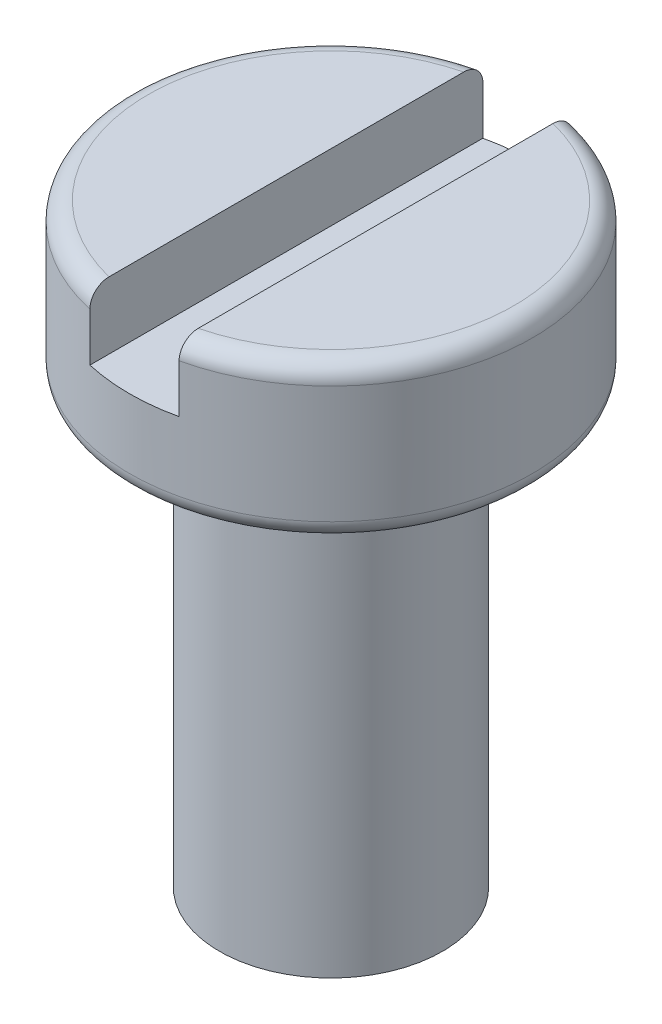
ISO-10303-21;
HEADER;
FILE_DESCRIPTION(('STEP AP214'),'2;1');
FILE_NAME('part.step','',(''),(''),'','','');
FILE_SCHEMA(('AUTOMOTIVE_DESIGN { 1 0 10303 214 1 1 1 1 }'));
ENDSEC;
DATA;
#1=APPLICATION_CONTEXT('core data for automotive mechanical design processes');
#2=APPLICATION_PROTOCOL_DEFINITION('international standard','automotive_design',2000,#1);
#3=PRODUCT_CONTEXT('',#1,'mechanical');
#4=PRODUCT('Part','Part','',(#3));
#5=PRODUCT_RELATED_PRODUCT_CATEGORY('part','',(#4));
#6=PRODUCT_DEFINITION_FORMATION('','',#4);
#7=PRODUCT_DEFINITION_CONTEXT('part definition',#1,'design');
#8=PRODUCT_DEFINITION('design','',#6,#7);
#9=PRODUCT_DEFINITION_SHAPE('','',#8);
#10=(LENGTH_UNIT() NAMED_UNIT(*) SI_UNIT(.MILLI.,.METRE.));
#11=(NAMED_UNIT(*) PLANE_ANGLE_UNIT() SI_UNIT($,.RADIAN.));
#12=(NAMED_UNIT(*) SI_UNIT($,.STERADIAN.) SOLID_ANGLE_UNIT());
#13=UNCERTAINTY_MEASURE_WITH_UNIT(LENGTH_MEASURE(1.E-05),#10,'distance_accuracy_value','');
#14=(GEOMETRIC_REPRESENTATION_CONTEXT(3) GLOBAL_UNCERTAINTY_ASSIGNED_CONTEXT((#13)) GLOBAL_UNIT_ASSIGNED_CONTEXT((#10,
#11,#12)) REPRESENTATION_CONTEXT('',''));
#15=CARTESIAN_POINT('',(0.,0.,0.));
#16=DIRECTION('',(0.,0.,1.));
#17=DIRECTION('',(1.,0.,0.));
#18=AXIS2_PLACEMENT_3D('',#15,#16,#17);
#19=CARTESIAN_POINT('',(0.,20.,0.));
#20=DIRECTION('',(0.,-1.,0.));
#21=DIRECTION('',(0.,0.,-1.));
#22=AXIS2_PLACEMENT_3D('',#19,#20,#21);
#23=PLANE('',#22);
#24=CARTESIAN_POINT('',(0.,20.,0.));
#25=DIRECTION('',(0.,-1.,0.));
#26=DIRECTION('',(0.,0.,-1.));
#27=AXIS2_PLACEMENT_3D('',#24,#25,#26);
#28=CIRCLE('',#27,2.46);
#29=CARTESIAN_POINT('',(-0.6,20.,-2.38570744224846));
#30=VERTEX_POINT('',#29);
#31=CARTESIAN_POINT('',(-0.6,20.,2.3857074422486));
#32=VERTEX_POINT('',#31);
#33=EDGE_CURVE('E104',#30,#32,#28,.F.);
#34=ORIENTED_EDGE('',*,*,#33,.T.);
#35=DIRECTION('',(0.,0.,1.));
#36=VECTOR('',#35,1.);
#37=CARTESIAN_POINT('',(-0.6,20.,2.71102334228302));
#38=LINE('',#37,#36);
#39=EDGE_CURVE('E101',#30,#32,#38,.T.);
#40=ORIENTED_EDGE('',*,*,#39,.F.);
#41=EDGE_LOOP('',(#34,#40));
#42=FACE_BOUND('',#41,.T.);
#43=ADVANCED_FACE('F35',(#42),#23,.F.);
#44=CARTESIAN_POINT('',(0.,19.75,0.));
#45=DIRECTION('',(0.,-1.,0.));
#46=DIRECTION('',(0.,0.,-1.));
#47=AXIS2_PLACEMENT_3D('',#44,#45,#46);
#48=TOROIDAL_SURFACE('',#47,2.46,0.25);
#49=CARTESIAN_POINT('',(-0.6,19.9057779269637,2.58686231688076));
#50=CARTESIAN_POINT('',(-0.6,19.8950398183509,2.5956435679496));
#51=CARTESIAN_POINT('',(-0.6,19.8835649113459,2.60353742344512));
#52=CARTESIAN_POINT('',(-0.6,19.8594480937063,2.61730071427246));
#53=CARTESIAN_POINT('',(-0.6,19.846805116745,2.62316827619331));
#54=CARTESIAN_POINT('',(-0.6,19.8207049337922,2.63268735414627));
#55=CARTESIAN_POINT('',(-0.6,19.8072475164309,2.63633829216775));
#56=CARTESIAN_POINT('',(-0.6,19.7799107452415,2.64130101178219));
#57=CARTESIAN_POINT('',(-0.6,19.7660314865879,2.64261331708466));
#58=CARTESIAN_POINT('',(-0.6,19.738395178757,2.64285617965291));
#59=CARTESIAN_POINT('',(-0.6,19.7246383380415,2.64181105425246));
#60=CARTESIAN_POINT('',(-0.6,19.6974964874994,2.6374228928476));
#61=CARTESIAN_POINT('',(-0.6,19.6841114783171,2.63407985286123));
#62=CARTESIAN_POINT('',(-0.6,19.6581028909833,2.62520726129129));
#63=CARTESIAN_POINT('',(-0.6,19.645478566111,2.61967989560636));
#64=CARTESIAN_POINT('',(-0.6,19.6213204884943,2.60661096468353));
#65=CARTESIAN_POINT('',(-0.6,19.609786785512,2.59906930759908));
#66=CARTESIAN_POINT('',(-0.6,19.5879670918565,2.58208635128699));
#67=CARTESIAN_POINT('',(-0.6,19.5776997639723,2.57262109024571));
#68=CARTESIAN_POINT('',(-0.6,19.5588555560857,2.55213651548936));
#69=CARTESIAN_POINT('',(-0.6,19.5502788528209,2.54111703950326));
#70=CARTESIAN_POINT('',(-0.6,19.5348419859735,2.51756279317136));
#71=CARTESIAN_POINT('',(-0.6,19.5280268479349,2.50499852227153));
#72=CARTESIAN_POINT('',(-0.6,19.5165412180445,2.47892562165189));
#73=CARTESIAN_POINT('',(-0.6,19.5118710171225,2.46541686411225));
#74=CARTESIAN_POINT('',(-0.6,19.5046834040679,2.43746147305775));
#75=CARTESIAN_POINT('',(-0.6,19.5022253760787,2.42299956182772));
#76=CARTESIAN_POINT('',(-0.6,19.4997225636304,2.39386809017465));
#77=CARTESIAN_POINT('',(-0.6,19.4996780748111,2.37919850453324));
#78=CARTESIAN_POINT('',(-0.6,19.5020180153436,2.3497740984476));
#79=CARTESIAN_POINT('',(-0.6,19.5044483852974,2.3350229106946));
#80=CARTESIAN_POINT('',(-0.6,19.5117449070815,2.30613455183196));
#81=CARTESIAN_POINT('',(-0.6,19.5166111916129,2.29199741421948));
#82=CARTESIAN_POINT('',(-0.6,19.5286718984968,2.26471817845948));
#83=CARTESIAN_POINT('',(-0.6,19.5358709457048,2.25157812149445));
#84=CARTESIAN_POINT('',(-0.6,19.5524143077675,2.22672417348261));
#85=CARTESIAN_POINT('',(-0.6,19.5617584549328,2.21501017106599));
#86=CARTESIAN_POINT('',(-0.6,19.5821446976601,2.19359931327809));
#87=CARTESIAN_POINT('',(-0.6,19.5931500850528,2.18386754370457));
#88=CARTESIAN_POINT('',(-0.6,19.6166881125292,2.16646889601282));
#89=CARTESIAN_POINT('',(-0.6,19.6292204309981,2.15880158414973));
#90=CARTESIAN_POINT('',(-0.6,19.654994143128,2.14603352411427));
#91=CARTESIAN_POINT('',(-0.6,19.6681962508577,2.14085347697661));
#92=CARTESIAN_POINT('',(-0.6,19.6952992227209,2.13286505733002));
#93=CARTESIAN_POINT('',(-0.6,19.7091999374493,2.13005617998664));
#94=CARTESIAN_POINT('',(-0.6,19.7368363949329,2.12696449025801));
#95=CARTESIAN_POINT('',(-0.6,19.7505636233152,2.12660516557791));
#96=CARTESIAN_POINT('',(-0.6,19.7778789014398,2.12822242302424));
#97=CARTESIAN_POINT('',(-0.6,19.7914669628874,2.13019880703996));
#98=CARTESIAN_POINT('',(-0.6,19.8179788523567,2.13638478002833));
#99=CARTESIAN_POINT('',(-0.6,19.8309079857046,2.14057171283409));
#100=CARTESIAN_POINT('',(-0.6,19.8558965522215,2.15102236109181));
#101=CARTESIAN_POINT('',(-0.6,19.8679559346654,2.15728619755261));
#102=CARTESIAN_POINT('',(-0.6,19.8910843669919,2.17180899084781));
#103=CARTESIAN_POINT('',(-0.6,19.9021337939875,2.18009916085056));
#104=CARTESIAN_POINT('',(-0.6,19.9227404635454,2.19836203634967));
#105=CARTESIAN_POINT('',(-0.6,19.9322974761134,2.20833500068789));
#106=CARTESIAN_POINT('',(-0.6,19.9499851160373,2.23003056226405));
#107=CARTESIAN_POINT('',(-0.6,19.958058183776,2.24180007994945));
#108=CARTESIAN_POINT('',(-0.6,19.972186772722,2.26649331028083));
#109=CARTESIAN_POINT('',(-0.6,19.9782419447608,2.27941722218843));
#110=CARTESIAN_POINT('',(-0.6,19.9883586493524,2.30650202512867));
#111=CARTESIAN_POINT('',(-0.6,19.9923493322226,2.32068941039095));
#112=CARTESIAN_POINT('',(-0.6,19.9979369938959,2.34952799110328));
#113=CARTESIAN_POINT('',(-0.6,19.9995337847543,2.36417922287773));
#114=CARTESIAN_POINT('',(-0.6,20.000296327843,2.39379345631476));
#115=CARTESIAN_POINT('',(-0.6,19.9994206262247,2.40875754873725));
#116=CARTESIAN_POINT('',(-0.6,19.9951594147004,2.43832912201416));
#117=CARTESIAN_POINT('',(-0.6,19.9917732700265,2.45293651171087));
#118=CARTESIAN_POINT('',(-0.6,19.9825823199898,2.48131275745753));
#119=CARTESIAN_POINT('',(-0.6,19.9767860479825,2.49508437744055));
#120=CARTESIAN_POINT('',(-0.6,19.9629195439454,2.5214172843565));
#121=CARTESIAN_POINT('',(-0.6,19.9548522718015,2.53398011833989));
#122=CARTESIAN_POINT('',(-0.6,19.9399012555252,2.55332109446276));
#123=CARTESIAN_POINT('',(-0.6,19.9336151471017,2.56056880475899));
#124=CARTESIAN_POINT('',(-0.6,19.9202625315426,2.57430626948078));
#125=CARTESIAN_POINT('',(-0.6,19.9131960419394,2.58079604092775));
#126=CARTESIAN_POINT('',(-0.6,19.9057779269637,2.58686231688076));
#127=B_SPLINE_CURVE_WITH_KNOTS('',3,(#49,#50,#51,#52,#53,#54,#55,#56,#57,#58,#59,#60,#61,#62,
#63,#64,#65,#66,#67,#68,#69,#70,#71,#72,#73,#74,#75,#76,#77,#78,#79,#80,#81,#82,#83,#84,#85,#86,
#87,#88,#89,#90,#91,#92,#93,#94,#95,#96,#97,#98,#99,#100,#101,#102,#103,#104,#105,#106,#107,
#108,#109,#110,#111,#112,#113,#114,#115,#116,#117,#118,#119,#120,#121,#122,#123,#124,#125,#126),
.UNSPECIFIED.,.T.,.F.,(4,2,2,2,2,2,2,2,2,2,2,2,2,2,2,2,2,2,2,2,2,2,2,2,2,2,2,2,2,2,2,2,2,2,2,2,
2,2,4),(0.,0.0415802938971037,0.083198928600957,0.124828411195371,0.166448570180792,
0.207641375076417,0.248834251353299,0.289986009055909,0.331139643494163,0.372841362924238,
0.414547439535753,0.457232632476987,0.499923613339573,0.543729095436656,0.587539943353091,
0.632179143563909,0.676820775845968,0.721551460228282,0.766278649058879,0.810132680496136,
0.853977490950431,0.896312268610293,0.938638030699984,0.979635425017785,1.02062934225808,
1.06121103910052,1.10179510081268,1.14304877711473,1.18430880471495,1.22693204392473,
1.26956265466308,1.3135726975485,1.35758619548361,1.40234198477537,1.44710909447208,
1.49171903241248,1.53627109549314,1.56499629658943,1.59372085246534),.UNSPECIFIED.);
#128=CARTESIAN_POINT('',(-0.6,19.75,2.64274478525649));
#129=VERTEX_POINT('',#128);
#130=EDGE_CURVE('E58',#32,#129,#127,.T.);
#131=ORIENTED_EDGE('',*,*,#130,.F.);
#132=ORIENTED_EDGE('',*,*,#33,.F.);
#133=CARTESIAN_POINT('',(-0.6,19.8944024686671,-2.17466848008618));
#134=CARTESIAN_POINT('',(-0.6,19.883309846262,-2.16652688736432));
#135=CARTESIAN_POINT('',(-0.6,19.8715393901536,-2.15929544056344));
#136=CARTESIAN_POINT('',(-0.6,19.8469488212528,-2.14689265741792));
#137=CARTESIAN_POINT('',(-0.6,19.8341278870049,-2.14172295221508));
#138=CARTESIAN_POINT('',(-0.6,19.8077853460394,-2.13362409480365));
#139=CARTESIAN_POINT('',(-0.6,19.794263294155,-2.13069638519483));
#140=CARTESIAN_POINT('',(-0.6,19.7669202433074,-2.12719403278441));
#141=CARTESIAN_POINT('',(-0.6,19.7530993134886,-2.12661885146695));
#142=CARTESIAN_POINT('',(-0.6,19.7257732920088,-2.12783146110016));
#143=CARTESIAN_POINT('',(-0.6,19.712266594452,-2.12958343059428));
#144=CARTESIAN_POINT('',(-0.6,19.6857384749176,-2.13532569735921));
#145=CARTESIAN_POINT('',(-0.6,19.6727170604,-2.13931602902404));
#146=CARTESIAN_POINT('',(-0.6,19.6474863404887,-2.1494105923049));
#147=CARTESIAN_POINT('',(-0.6,19.635279076258,-2.15551991523306));
#148=CARTESIAN_POINT('',(-0.6,19.6120284455293,-2.16965153318031));
#149=CARTESIAN_POINT('',(-0.6,19.6009852039983,-2.17767403329327));
#150=CARTESIAN_POINT('',(-0.6,19.5800642470021,-2.19561844754873));
#151=CARTESIAN_POINT('',(-0.6,19.5702241638525,-2.20558420676426));
#152=CARTESIAN_POINT('',(-0.6,19.5522879155651,-2.22697713536075));
#153=CARTESIAN_POINT('',(-0.6,19.5441920464871,-2.23840455231715));
#154=CARTESIAN_POINT('',(-0.6,19.5296784229926,-2.26282410847462));
#155=CARTESIAN_POINT('',(-0.6,19.5233291210497,-2.27585694646556));
#156=CARTESIAN_POINT('',(-0.6,19.5128429916506,-2.30278438881787));
#157=CARTESIAN_POINT('',(-0.6,19.5087065078549,-2.31667912666237));
#158=CARTESIAN_POINT('',(-0.6,19.5026635081991,-2.34533487622194));
#159=CARTESIAN_POINT('',(-0.6,19.500819560799,-2.36010911604456));
#160=CARTESIAN_POINT('',(-0.6,19.4996171492246,-2.38975919377417));
#161=CARTESIAN_POINT('',(-0.6,19.500258861375,-2.40463503881397));
#162=CARTESIAN_POINT('',(-0.6,19.5040358851863,-2.43418181941932));
#163=CARTESIAN_POINT('',(-0.6,19.5071898869517,-2.44885037722511));
#164=CARTESIAN_POINT('',(-0.6,19.5159467663178,-2.47743847402221));
#165=CARTESIAN_POINT('',(-0.6,19.5215495385545,-2.49135804521147));
#166=CARTESIAN_POINT('',(-0.6,19.5349828775226,-2.51785900108877));
#167=CARTESIAN_POINT('',(-0.6,19.5427846303755,-2.53045497621151));
#168=CARTESIAN_POINT('',(-0.6,19.5604427436654,-2.55411450413128));
#169=CARTESIAN_POINT('',(-0.6,19.5702988333929,-2.56517825851681));
#170=CARTESIAN_POINT('',(-0.6,19.5915255957485,-2.58516246124834));
#171=CARTESIAN_POINT('',(-0.6,19.6028525595357,-2.59412932678523));
#172=CARTESIAN_POINT('',(-0.6,19.6268844133151,-2.60997367876158));
#173=CARTESIAN_POINT('',(-0.6,19.639589089596,-2.61685148862899));
#174=CARTESIAN_POINT('',(-0.6,19.665659389012,-2.6281382460571));
#175=CARTESIAN_POINT('',(-0.6,19.6789992721377,-2.6326066819527));
#176=CARTESIAN_POINT('',(-0.6,19.7062466045649,-2.6391957173654));
#177=CARTESIAN_POINT('',(-0.6,19.7201539880588,-2.64131658831051));
#178=CARTESIAN_POINT('',(-0.6,19.7478812567646,-2.64312421655654));
#179=CARTESIAN_POINT('',(-0.6,19.7616984300182,-2.64285282687362));
#180=CARTESIAN_POINT('',(-0.6,19.7890887423948,-2.63998487487521));
#181=CARTESIAN_POINT('',(-0.6,19.8026618917013,-2.63738840981912));
#182=CARTESIAN_POINT('',(-0.6,19.8291322877508,-2.62996726244901));
#183=CARTESIAN_POINT('',(-0.6,19.8420317379529,-2.62515042644825));
#184=CARTESIAN_POINT('',(-0.6,19.8668513236063,-2.61344256334287));
#185=CARTESIAN_POINT('',(-0.6,19.8787714252024,-2.60655146457123));
#186=CARTESIAN_POINT('',(-0.6,19.901442031466,-2.59081746857535));
#187=CARTESIAN_POINT('',(-0.6,19.9121780352306,-2.58195369313075));
#188=CARTESIAN_POINT('',(-0.6,19.9320495300079,-2.56258513390767));
#189=CARTESIAN_POINT('',(-0.6,19.9411848615979,-2.55208018686957));
#190=CARTESIAN_POINT('',(-0.6,19.9578158880632,-2.52948107517064));
#191=CARTESIAN_POINT('',(-0.6,19.9652706100935,-2.51735676836809));
#192=CARTESIAN_POINT('',(-0.6,19.9780989930115,-2.49205357024425));
#193=CARTESIAN_POINT('',(-0.6,19.983472374073,-2.47887453740736));
#194=CARTESIAN_POINT('',(-0.6,19.9921323415263,-2.45146527387591));
#195=CARTESIAN_POINT('',(-0.6,19.9953602692204,-2.43721650353487));
#196=CARTESIAN_POINT('',(-0.6,19.9994319700037,-2.40838263421632));
#197=CARTESIAN_POINT('',(-0.6,20.0002755259457,-2.39379750472817));
#198=CARTESIAN_POINT('',(-0.6,19.999559832905,-2.36438314286838));
#199=CARTESIAN_POINT('',(-0.6,19.9979504524109,-2.34955511187288));
#200=CARTESIAN_POINT('',(-0.6,19.9922792732344,-2.3203705929169));
#201=CARTESIAN_POINT('',(-0.6,19.9882167164322,-2.3060142521724));
#202=CARTESIAN_POINT('',(-0.6,19.9777097480094,-2.27810596316031));
#203=CARTESIAN_POINT('',(-0.6,19.9712516736316,-2.2645591569393));
#204=CARTESIAN_POINT('',(-0.6,19.9561211900623,-2.23877753931798));
#205=CARTESIAN_POINT('',(-0.6,19.9474515009904,-2.22654114227506));
#206=CARTESIAN_POINT('',(-0.6,19.9313801864166,-2.20759176204346));
#207=CARTESIAN_POINT('',(-0.6,19.9245303985509,-2.20040383931934));
#208=CARTESIAN_POINT('',(-0.6,19.9100385586368,-2.1868758926182));
#209=CARTESIAN_POINT('',(-0.6,19.9023965328193,-2.18053584058426));
#210=CARTESIAN_POINT('',(-0.6,19.8944024686671,-2.17466848008618));
#211=B_SPLINE_CURVE_WITH_KNOTS('',3,(#133,#134,#135,#136,#137,#138,#139,#140,#141,#142,#143,
#144,#145,#146,#147,#148,#149,#150,#151,#152,#153,#154,#155,#156,#157,#158,#159,#160,#161,#162,
#163,#164,#165,#166,#167,#168,#169,#170,#171,#172,#173,#174,#175,#176,#177,#178,#179,#180,#181,
#182,#183,#184,#185,#186,#187,#188,#189,#190,#191,#192,#193,#194,#195,#196,#197,#198,#199,#200,
#201,#202,#203,#204,#205,#206,#207,#208,#209,#210),.UNSPECIFIED.,.T.,.F.,(4,2,2,2,2,2,2,2,2,2,2,
2,2,2,2,2,2,2,2,2,2,2,2,2,2,2,2,2,2,2,2,2,2,2,2,2,2,2,4),(0.,0.041244633660872,
0.0825218334872765,0.123825570637018,0.165119852443379,0.205785806789995,0.246452386014894,
0.287217359785701,0.327986705554893,0.369812851829636,0.411646092017453,0.454939786369004,
0.498240202472458,0.542698143433272,0.587159238152734,0.63195422432254,0.67674728327372,
0.720978707422788,0.765204306670547,0.808331228569678,0.851451470144276,0.893451661420113,
0.935446996080551,0.976709093215098,1.01796946441029,1.05908513509269,1.10020222650887,
1.14177714209757,1.18335619609043,1.22585974121034,1.26836899874418,1.31199731328668,
1.3556296009759,1.40016564967373,1.44471546866291,1.48952338396887,1.534276452409,
1.56400099805382,1.59372455983925),.UNSPECIFIED.);
#212=CARTESIAN_POINT('',(-0.6,19.75,-2.64274478525636));
#213=VERTEX_POINT('',#212);
#214=EDGE_CURVE('E94',#213,#30,#211,.T.);
#215=ORIENTED_EDGE('',*,*,#214,.F.);
#216=CARTESIAN_POINT('',(0.,19.75,0.));
#217=DIRECTION('',(0.,-1.,0.));
#218=DIRECTION('',(0.,0.,-1.));
#219=AXIS2_PLACEMENT_3D('',#216,#217,#218);
#220=CIRCLE('',#219,2.71);
#221=EDGE_CURVE('E109',#129,#213,#220,.T.);
#222=ORIENTED_EDGE('',*,*,#221,.F.);
#223=EDGE_LOOP('',(#131,#132,#215,#222));
#224=FACE_BOUND('',#223,.T.);
#225=ADVANCED_FACE('F153',(#224),#48,.T.);
#226=CARTESIAN_POINT('',(0.,12.,0.));
#227=DIRECTION('',(0.,1.,0.));
#228=DIRECTION('',(0.,0.,1.));
#229=AXIS2_PLACEMENT_3D('',#226,#227,#228);
#230=CYLINDRICAL_SURFACE('',#229,2.71);
#231=ORIENTED_EDGE('',*,*,#221,.T.);
#232=DIRECTION('',(0.,1.,0.));
#233=VECTOR('',#232,1.);
#234=CARTESIAN_POINT('',(-0.6,12.,-2.64274478525641));
#235=LINE('',#234,#233);
#236=CARTESIAN_POINT('',(-0.6,19.1,-2.64274478525636));
#237=VERTEX_POINT('',#236);
#238=EDGE_CURVE('E175',#213,#237,#235,.F.);
#239=ORIENTED_EDGE('',*,*,#238,.T.);
#240=CARTESIAN_POINT('',(0.,19.1,0.));
#241=DIRECTION('',(0.,1.,0.));
#242=DIRECTION('',(0.,0.,1.));
#243=AXIS2_PLACEMENT_3D('',#240,#241,#242);
#244=CIRCLE('',#243,2.71);
#245=CARTESIAN_POINT('',(0.6,19.1,-2.64274478525636));
#246=VERTEX_POINT('',#245);
#247=EDGE_CURVE('E12',#246,#237,#244,.T.);
#248=ORIENTED_EDGE('',*,*,#247,.F.);
#249=DIRECTION('',(0.,1.,0.));
#250=VECTOR('',#249,1.);
#251=CARTESIAN_POINT('',(0.6,12.,-2.64274478525641));
#252=LINE('',#251,#250);
#253=CARTESIAN_POINT('',(0.6,19.7500000000013,-2.64274478526424));
#254=VERTEX_POINT('',#253);
#255=EDGE_CURVE('E183',#246,#254,#252,.T.);
#256=ORIENTED_EDGE('',*,*,#255,.T.);
#257=CARTESIAN_POINT('',(0.6,19.75,2.64274478525649));
#258=VERTEX_POINT('',#257);
#259=EDGE_CURVE('E105',#254,#258,#220,.T.);
#260=ORIENTED_EDGE('',*,*,#259,.T.);
#261=DIRECTION('',(0.,1.,0.));
#262=VECTOR('',#261,1.);
#263=CARTESIAN_POINT('',(0.6,12.,2.64274478525643));
#264=LINE('',#263,#262);
#265=CARTESIAN_POINT('',(0.6,19.1,2.64274478525648));
#266=VERTEX_POINT('',#265);
#267=EDGE_CURVE('E89',#258,#266,#264,.F.);
#268=ORIENTED_EDGE('',*,*,#267,.T.);
#269=CARTESIAN_POINT('',(-0.6,19.1,2.64274478525648));
#270=VERTEX_POINT('',#269);
#271=EDGE_CURVE('E39',#270,#266,#244,.T.);
#272=ORIENTED_EDGE('',*,*,#271,.F.);
#273=DIRECTION('',(0.,1.,0.));
#274=VECTOR('',#273,1.);
#275=CARTESIAN_POINT('',(-0.6,12.,2.64274478525643));
#276=LINE('',#275,#274);
#277=EDGE_CURVE('E179',#270,#129,#276,.T.);
#278=ORIENTED_EDGE('',*,*,#277,.T.);
#279=EDGE_LOOP('',(#231,#239,#248,#256,#260,#268,#272,#278));
#280=FACE_BOUND('',#279,.T.);
#281=CARTESIAN_POINT('',(0.,18.17,0.));
#282=DIRECTION('',(0.,-1.,0.));
#283=DIRECTION('',(0.,0.,-1.));
#284=AXIS2_PLACEMENT_3D('',#281,#282,#283);
#285=CIRCLE('',#284,2.71);
#286=CARTESIAN_POINT('',(0.,18.17,-2.70999999999994));
#287=VERTEX_POINT('',#286);
#288=EDGE_CURVE('E188',#287,#287,#285,.F.);
#289=ORIENTED_EDGE('',*,*,#288,.T.);
#290=EDGE_LOOP('',(#289));
#291=FACE_BOUND('',#290,.T.);
#292=ADVANCED_FACE('F151',(#280,#291),#230,.T.);
#293=CARTESIAN_POINT('',(0.6,20.,2.3857074422486));
#294=VERTEX_POINT('',#293);
#295=CARTESIAN_POINT('',(0.6,20.,-2.38570744224846));
#296=VERTEX_POINT('',#295);
#297=EDGE_CURVE('E100',#294,#296,#28,.F.);
#298=ORIENTED_EDGE('',*,*,#297,.T.);
#299=DIRECTION('',(0.,0.,-1.));
#300=VECTOR('',#299,1.);
#301=CARTESIAN_POINT('',(0.6,20.,2.71102334228302));
#302=LINE('',#301,#300);
#303=EDGE_CURVE('E50',#294,#296,#302,.T.);
#304=ORIENTED_EDGE('',*,*,#303,.F.);
#305=EDGE_LOOP('',(#298,#304));
#306=FACE_BOUND('',#305,.T.);
#307=ADVANCED_FACE('F99',(#306),#23,.F.);
#308=CARTESIAN_POINT('',(0.,17.92,0.));
#309=DIRECTION('',(0.,-1.,0.));
#310=DIRECTION('',(0.,0.,-1.));
#311=AXIS2_PLACEMENT_3D('',#308,#309,#310);
#312=PLANE('',#311);
#313=CARTESIAN_POINT('',(0.,17.92,0.));
#314=DIRECTION('',(0.,-1.,0.));
#315=DIRECTION('',(0.,0.,-1.));
#316=AXIS2_PLACEMENT_3D('',#313,#314,#315);
#317=CIRCLE('',#316,1.65);
#318=CARTESIAN_POINT('',(0.,17.92,-1.64999999999994));
#319=VERTEX_POINT('',#318);
#320=EDGE_CURVE('E118',#319,#319,#317,.F.);
#321=ORIENTED_EDGE('',*,*,#320,.T.);
#322=EDGE_LOOP('',(#321));
#323=FACE_BOUND('',#322,.T.);
#324=CARTESIAN_POINT('',(0.,17.92,0.));
#325=DIRECTION('',(0.,-1.,0.));
#326=DIRECTION('',(0.,0.,-1.));
#327=AXIS2_PLACEMENT_3D('',#324,#325,#326);
#328=CIRCLE('',#327,2.46);
#329=CARTESIAN_POINT('',(0.,17.92,-2.45999999999994));
#330=VERTEX_POINT('',#329);
#331=EDGE_CURVE('E108',#330,#330,#328,.T.);
#332=ORIENTED_EDGE('',*,*,#331,.T.);
#333=EDGE_LOOP('',(#332));
#334=FACE_BOUND('',#333,.T.);
#335=ADVANCED_FACE('F142',(#323,#334),#312,.T.);
#336=CARTESIAN_POINT('',(0.,17.92,0.));
#337=DIRECTION('',(0.,-1.,0.));
#338=DIRECTION('',(0.,0.,-1.));
#339=AXIS2_PLACEMENT_3D('',#336,#337,#338);
#340=CYLINDRICAL_SURFACE('',#339,1.5);
#341=CARTESIAN_POINT('',(0.,17.77,0.));
#342=DIRECTION('',(0.,-1.,0.));
#343=DIRECTION('',(0.,0.,-1.));
#344=AXIS2_PLACEMENT_3D('',#341,#342,#343);
#345=CIRCLE('',#344,1.5);
#346=CARTESIAN_POINT('',(0.,17.77,-1.49999999999995));
#347=VERTEX_POINT('',#346);
#348=EDGE_CURVE('E115',#347,#347,#345,.T.);
#349=ORIENTED_EDGE('',*,*,#348,.T.);
#350=EDGE_LOOP('',(#349));
#351=FACE_BOUND('',#350,.T.);
#352=CARTESIAN_POINT('',(0.,12.,0.));
#353=DIRECTION('',(0.,-1.,0.));
#354=DIRECTION('',(0.,0.,-1.));
#355=AXIS2_PLACEMENT_3D('',#352,#353,#354);
#356=CIRCLE('',#355,1.5);
#357=CARTESIAN_POINT('',(0.,12.,-1.49999999999999));
#358=VERTEX_POINT('',#357);
#359=EDGE_CURVE('E181',#358,#358,#356,.T.);
#360=ORIENTED_EDGE('',*,*,#359,.F.);
#361=EDGE_LOOP('',(#360));
#362=FACE_BOUND('',#361,.T.);
#363=ADVANCED_FACE('F137',(#351,#362),#340,.T.);
#364=CARTESIAN_POINT('',(0.,12.,0.));
#365=DIRECTION('',(0.,-1.,0.));
#366=DIRECTION('',(0.,0.,-1.));
#367=AXIS2_PLACEMENT_3D('',#364,#365,#366);
#368=PLANE('',#367);
#369=ORIENTED_EDGE('',*,*,#359,.T.);
#370=EDGE_LOOP('',(#369));
#371=FACE_BOUND('',#370,.T.);
#372=ADVANCED_FACE('F141',(#371),#368,.T.);
#373=CARTESIAN_POINT('',(0.6,19.9057779269637,2.58686231688076));
#374=CARTESIAN_POINT('',(0.6,19.9169025931632,2.57776327985589));
#375=CARTESIAN_POINT('',(0.6,19.9272527000197,2.56769785400049));
#376=CARTESIAN_POINT('',(0.6,19.9461122010159,2.54595309368041));
#377=CARTESIAN_POINT('',(0.6,19.9546187661238,2.53427132321102));
#378=CARTESIAN_POINT('',(0.6,19.9695520722048,2.50967246325872));
#379=CARTESIAN_POINT('',(0.6,19.9759821432381,2.4967573951484));
#380=CARTESIAN_POINT('',(0.6,19.986628146274,2.47005100990524));
#381=CARTESIAN_POINT('',(0.6,19.9908446414511,2.4562599166513));
#382=CARTESIAN_POINT('',(0.6,19.9970369963394,2.42789942410108));
#383=CARTESIAN_POINT('',(0.6,19.9989672167057,2.41332005783486));
#384=CARTESIAN_POINT('',(0.6,20.000399004893,2.38404134540786));
#385=CARTESIAN_POINT('',(0.6,19.9999001689155,2.36934197970425));
#386=CARTESIAN_POINT('',(0.6,19.9964620664074,2.33996916480795));
#387=CARTESIAN_POINT('',(0.6,19.9934801924616,2.32530068258425));
#388=CARTESIAN_POINT('',(0.6,19.9850964783542,2.29667109241443));
#389=CARTESIAN_POINT('',(0.6,19.9796945395019,2.2827100133422));
#390=CARTESIAN_POINT('',(0.6,19.9666059424516,2.25590716603894));
#391=CARTESIAN_POINT('',(0.6,19.9589200361884,2.24306503122227));
#392=CARTESIAN_POINT('',(0.6,19.9414563928667,2.21889013776512));
#393=CARTESIAN_POINT('',(0.6,19.9316788602527,2.20755723178169));
#394=CARTESIAN_POINT('',(0.6,19.9105254937946,2.18699962520666));
#395=CARTESIAN_POINT('',(0.6,19.8991890590445,2.17773442381394));
#396=CARTESIAN_POINT('',(0.6,19.8750742873265,2.16132135360425));
#397=CARTESIAN_POINT('',(0.6,19.8622962643812,2.15417302489164));
#398=CARTESIAN_POINT('',(0.6,19.8361430033382,2.14246442389688));
#399=CARTESIAN_POINT('',(0.6,19.8228045123803,2.13782205869663));
#400=CARTESIAN_POINT('',(0.6,19.7955250040227,2.13092034608472));
#401=CARTESIAN_POINT('',(0.6,19.7815841099168,2.12866051342263));
#402=CARTESIAN_POINT('',(0.6,19.7539410419268,2.12663860571753));
#403=CARTESIAN_POINT('',(0.6,19.7402441136823,2.12680418647436));
#404=CARTESIAN_POINT('',(0.6,19.7130767965782,2.12945106075111));
#405=CARTESIAN_POINT('',(0.6,19.6996063923996,2.13193219703183));
#406=CARTESIAN_POINT('',(0.6,19.6733683618953,2.13909636739112));
#407=CARTESIAN_POINT('',(0.6,19.6605964526621,2.14376376420775));
#408=CARTESIAN_POINT('',(0.6,19.6359964621806,2.15513746178243));
#409=CARTESIAN_POINT('',(0.6,19.6241684496797,2.1618439108812));
#410=CARTESIAN_POINT('',(0.6,19.601542619827,2.17722920089875));
#411=CARTESIAN_POINT('',(0.6,19.5907687327629,2.18594319676499));
#412=CARTESIAN_POINT('',(0.6,19.5707767489848,2.20500208607076));
#413=CARTESIAN_POINT('',(0.6,19.5615588986955,2.21534723733057));
#414=CARTESIAN_POINT('',(0.6,19.5446090167065,2.23774802957973));
#415=CARTESIAN_POINT('',(0.6,19.5369378372795,2.24984971468583));
#416=CARTESIAN_POINT('',(0.6,19.5236639771517,2.27513870448689));
#417=CARTESIAN_POINT('',(0.6,19.5180616451257,2.28832619172072));
#418=CARTESIAN_POINT('',(0.6,19.5089124037288,2.31585523933381));
#419=CARTESIAN_POINT('',(0.6,19.5054351383223,2.33021997799191));
#420=CARTESIAN_POINT('',(0.6,19.5009020956458,2.35932719775068));
#421=CARTESIAN_POINT('',(0.6,19.4998465754812,2.37406971879079));
#422=CARTESIAN_POINT('',(0.6,19.500191900761,2.40374444974833));
#423=CARTESIAN_POINT('',(0.6,19.5016291241333,2.41867625833318));
#424=CARTESIAN_POINT('',(0.6,19.5070052730212,2.4480835471559));
#425=CARTESIAN_POINT('',(0.6,19.5109441857128,2.46255902973257));
#426=CARTESIAN_POINT('',(0.6,19.5212025541868,2.49053982214567));
#427=CARTESIAN_POINT('',(0.6,19.5275070839278,2.50405059558232));
#428=CARTESIAN_POINT('',(0.6,19.5423437493798,2.52978919121932));
#429=CARTESIAN_POINT('',(0.6,19.5508756501157,2.54201714855893));
#430=CARTESIAN_POINT('',(0.6,19.5697308086526,2.56455203293997));
#431=CARTESIAN_POINT('',(0.6,19.5800108798647,2.57489507872222));
#432=CARTESIAN_POINT('',(0.6,19.6022035649378,2.59365023100117));
#433=CARTESIAN_POINT('',(0.6,19.6141159286871,2.60206263279815));
#434=CARTESIAN_POINT('',(0.6,19.6388907140877,2.61647986456498));
#435=CARTESIAN_POINT('',(0.6,19.6517190987736,2.62254319932373));
#436=CARTESIAN_POINT('',(0.6,19.6782260522056,2.63237633658921));
#437=CARTESIAN_POINT('',(0.6,19.6919044706715,2.63614654324103));
#438=CARTESIAN_POINT('',(0.6,19.7194094189198,2.64121297015998));
#439=CARTESIAN_POINT('',(0.6,19.7332265625517,2.6425602568666));
#440=CARTESIAN_POINT('',(0.6,19.7608928583866,2.64289385113037));
#441=CARTESIAN_POINT('',(0.6,19.774742016277,2.64187970079877));
#442=CARTESIAN_POINT('',(0.6,19.8019561619789,2.63754148316974));
#443=CARTESIAN_POINT('',(0.6,19.815324162739,2.63423619107647));
#444=CARTESIAN_POINT('',(0.6,19.8413082690277,2.62544269741125));
#445=CARTESIAN_POINT('',(0.6,19.8539252946826,2.61995723313255));
#446=CARTESIAN_POINT('',(0.6,19.8730332193186,2.60969009171426));
#447=CARTESIAN_POINT('',(0.6,19.8798865254629,2.60556723403541));
#448=CARTESIAN_POINT('',(0.6,19.8931656993693,2.59668329687964));
#449=CARTESIAN_POINT('',(0.6,19.8995915754082,2.59192222976658));
#450=CARTESIAN_POINT('',(0.6,19.9057779269637,2.58686231688076));
#451=B_SPLINE_CURVE_WITH_KNOTS('',3,(#373,#374,#375,#376,#377,#378,#379,#380,#381,#382,#383,
#384,#385,#386,#387,#388,#389,#390,#391,#392,#393,#394,#395,#396,#397,#398,#399,#400,#401,#402,
#403,#404,#405,#406,#407,#408,#409,#410,#411,#412,#413,#414,#415,#416,#417,#418,#419,#420,#421,
#422,#423,#424,#425,#426,#427,#428,#429,#430,#431,#432,#433,#434,#435,#436,#437,#438,#439,#440,
#441,#442,#443,#444,#445,#446,#447,#448,#449,#450),.UNSPECIFIED.,.T.,.F.,(4,2,2,2,2,2,2,2,2,2,2,
2,2,2,2,2,2,2,2,2,2,2,2,2,2,2,2,2,2,2,2,2,2,2,2,2,2,2,4),(0.,0.0430855035237854,
0.0862366635233199,0.129318274607084,0.172388919614342,0.216305594472259,0.260229570146706,
0.304923169830728,0.34961859229368,0.394299316262213,0.438975674939816,0.482680087516964,
0.526374998229287,0.56853498279318,0.610686378972844,0.651583128943029,0.692477101996985,
0.733082945051566,0.773691742881658,0.81507448531775,0.856463775275982,0.899254000364514,
0.942051433847857,0.986185237027289,1.03032372547284,1.07511178195504,1.11989960884705,
1.1644094698361,1.20891463718075,1.25244794006747,1.29597457990448,1.33833417215876,
1.38068629671607,1.42213483739557,1.46359141572345,1.50471222537862,1.54578156849128,
1.56974158940085,1.59370114620628),.UNSPECIFIED.);
#452=EDGE_CURVE('E85',#258,#294,#451,.T.);
#453=ORIENTED_EDGE('',*,*,#452,.F.);
#454=ORIENTED_EDGE('',*,*,#259,.F.);
#455=CARTESIAN_POINT('',(0.6,19.8944024686671,-2.17466848008618));
#456=CARTESIAN_POINT('',(0.6,19.9060570400945,-2.18322407893569));
#457=CARTESIAN_POINT('',(0.6,19.9169803248193,-2.19279758526086));
#458=CARTESIAN_POINT('',(0.6,19.9370611188982,-2.21366339300844));
#459=CARTESIAN_POINT('',(0.6,19.9462156765038,-2.22495851231939));
#460=CARTESIAN_POINT('',(0.6,19.9625027797233,-2.24889217502332));
#461=CARTESIAN_POINT('',(0.6,19.9696390209244,-2.2615282040408));
#462=CARTESIAN_POINT('',(0.6,19.9817402400606,-2.28779372765297));
#463=CARTESIAN_POINT('',(0.6,19.9867058285108,-2.30142294164593));
#464=CARTESIAN_POINT('',(0.6,19.994440068445,-2.32962016359587));
#465=CARTESIAN_POINT('',(0.6,19.9971570709489,-2.34420235461865));
#466=CARTESIAN_POINT('',(0.6,20.0001358276639,-2.37361704300086));
#467=CARTESIAN_POINT('',(0.6,20.0003972219943,-2.38844957673009));
#468=CARTESIAN_POINT('',(0.6,19.9984385076856,-2.41812153190812));
#469=CARTESIAN_POINT('',(0.6,19.9961900233632,-2.43295909723152));
#470=CARTESIAN_POINT('',(0.6,19.9892108448965,-2.4620395481522));
#471=CARTESIAN_POINT('',(0.6,19.9844802137733,-2.47628244883796));
#472=CARTESIAN_POINT('',(0.6,19.9727028760047,-2.50362058722193));
#473=CARTESIAN_POINT('',(0.6,19.9656780879161,-2.51672525526337));
#474=CARTESIAN_POINT('',(0.6,19.9494778455635,-2.54153104070058));
#475=CARTESIAN_POINT('',(0.6,19.9403026547957,-2.55323232979184));
#476=CARTESIAN_POINT('',(0.6,19.9202884054529,-2.57460188991214));
#477=CARTESIAN_POINT('',(0.6,19.9094933420055,-2.58431135240996));
#478=CARTESIAN_POINT('',(0.6,19.8863882309249,-2.60172032836337));
#479=CARTESIAN_POINT('',(0.6,19.8740784175532,-2.60942015204339));
#480=CARTESIAN_POINT('',(0.6,19.8486463685603,-2.62237743443215));
#481=CARTESIAN_POINT('',(0.6,19.8355544254919,-2.62769437342539));
#482=CARTESIAN_POINT('',(0.6,19.8086529489945,-2.63600505557404));
#483=CARTESIAN_POINT('',(0.6,19.7948435066925,-2.63899909298638));
#484=CARTESIAN_POINT('',(0.6,19.7671891401196,-2.64252920065069));
#485=CARTESIAN_POINT('',(0.6,19.7533501846242,-2.64311216803087));
#486=CARTESIAN_POINT('',(0.6,19.7257734102776,-2.64193029103051));
#487=CARTESIAN_POINT('',(0.6,19.7120355857688,-2.64016557900829));
#488=CARTESIAN_POINT('',(0.6,19.6851388628416,-2.63436414671132));
#489=CARTESIAN_POINT('',(0.6,19.6719768948774,-2.63034162727624));
#490=CARTESIAN_POINT('',(0.6,19.6465067528842,-2.62016231911069));
#491=CARTESIAN_POINT('',(0.6,19.6341985977152,-2.61400548325303));
#492=CARTESIAN_POINT('',(0.6,19.6106656855043,-2.59968533150608));
#493=CARTESIAN_POINT('',(0.6,19.5994511971851,-2.59150515482894));
#494=CARTESIAN_POINT('',(0.6,19.5785198481135,-2.573413324907));
#495=CARTESIAN_POINT('',(0.6,19.5688031198337,-2.56350151866972));
#496=CARTESIAN_POINT('',(0.6,19.5509245595677,-2.54201310810556));
#497=CARTESIAN_POINT('',(0.6,19.542798990086,-2.53040634560003));
#498=CARTESIAN_POINT('',(0.6,19.5285537443924,-2.50602163111241));
#499=CARTESIAN_POINT('',(0.6,19.5224343263039,-2.49324352868928));
#500=CARTESIAN_POINT('',(0.6,19.5122063343919,-2.46652106947608));
#501=CARTESIAN_POINT('',(0.6,19.5081546969006,-2.45255491723692));
#502=CARTESIAN_POINT('',(0.6,19.5023959961974,-2.4241472778217));
#503=CARTESIAN_POINT('',(0.6,19.5006892446479,-2.40970572772093));
#504=CARTESIAN_POINT('',(0.6,19.4996397433858,-2.38040959111145));
#505=CARTESIAN_POINT('',(0.6,19.5003512502473,-2.3655530420643));
#506=CARTESIAN_POINT('',(0.6,19.5042345418162,-2.33616415270226));
#507=CARTESIAN_POINT('',(0.6,19.5074065341372,-2.32163183985258));
#508=CARTESIAN_POINT('',(0.6,19.5161699948991,-2.29317473056145));
#509=CARTESIAN_POINT('',(0.6,19.521782435842,-2.2792563789088));
#510=CARTESIAN_POINT('',(0.6,19.535291702791,-2.25257458581238));
#511=CARTESIAN_POINT('',(0.6,19.5431884729361,-2.23981111613708));
#512=CARTESIAN_POINT('',(0.6,19.5609566202444,-2.21598100865319));
#513=CARTESIAN_POINT('',(0.6,19.5708028509134,-2.2048956453758));
#514=CARTESIAN_POINT('',(0.6,19.5922695908807,-2.18459992533316));
#515=CARTESIAN_POINT('',(0.6,19.6038897961554,-2.17538924791429));
#516=CARTESIAN_POINT('',(0.6,19.6281949261132,-2.15941612419893));
#517=CARTESIAN_POINT('',(0.6,19.6408359719508,-2.15258694443165));
#518=CARTESIAN_POINT('',(0.6,19.6671143999394,-2.14123667186962));
#519=CARTESIAN_POINT('',(0.6,19.6807515084726,-2.13671494792317));
#520=CARTESIAN_POINT('',(0.6,19.7081218578869,-2.13026324952045));
#521=CARTESIAN_POINT('',(0.6,19.7218350953147,-2.12824824737505));
#522=CARTESIAN_POINT('',(0.6,19.7494073354562,-2.12659809551568));
#523=CARTESIAN_POINT('',(0.6,19.7632663568098,-2.12696325391353));
#524=CARTESIAN_POINT('',(0.6,19.7904617126021,-2.13003104072805));
#525=CARTESIAN_POINT('',(0.6,19.8038029723233,-2.13269054463269));
#526=CARTESIAN_POINT('',(0.6,19.8298426311236,-2.14019479291303));
#527=CARTESIAN_POINT('',(0.6,19.8425418141583,-2.14503679717482));
#528=CARTESIAN_POINT('',(0.6,19.8617102081237,-2.15421851591737));
#529=CARTESIAN_POINT('',(0.6,19.8685125722415,-2.15788075940237));
#530=CARTESIAN_POINT('',(0.6,19.8817469474741,-2.16582142405663));
#531=CARTESIAN_POINT('',(0.6,19.8881789719767,-2.17009982293254));
#532=CARTESIAN_POINT('',(0.6,19.8944024686671,-2.17466848008618));
#533=B_SPLINE_CURVE_WITH_KNOTS('',3,(#455,#456,#457,#458,#459,#460,#461,#462,#463,#464,#465,
#466,#467,#468,#469,#470,#471,#472,#473,#474,#475,#476,#477,#478,#479,#480,#481,#482,#483,#484,
#485,#486,#487,#488,#489,#490,#491,#492,#493,#494,#495,#496,#497,#498,#499,#500,#501,#502,#503,
#504,#505,#506,#507,#508,#509,#510,#511,#512,#513,#514,#515,#516,#517,#518,#519,#520,#521,#522,
#523,#524,#525,#526,#527,#528,#529,#530,#531,#532),.UNSPECIFIED.,.T.,.F.,(4,2,2,2,2,2,2,2,2,2,2,
2,2,2,2,2,2,2,2,2,2,2,2,2,2,2,2,2,2,2,2,2,2,2,2,2,2,2,4),(0.,0.0433440285060391,
0.0867597786549024,0.130095511088372,0.173419047117662,0.217712064392678,0.262011572912983,
0.306817032206702,0.3516213539565,0.396009556457493,0.440392322760467,0.483735755242152,
0.527072492911341,0.569257294875506,0.611436752145796,0.652791813664912,0.69414454375252,
0.735240047700854,0.776336459124293,0.817787606267617,0.859242417545618,0.901553492425488,
0.943870009162313,0.987296155101078,1.03072807231751,1.07514081058416,1.11955729676431,
1.16436327162598,1.20916815089285,1.25342887261887,1.29768201744366,1.34057062241628,
1.38344748989638,1.42482638848863,1.46621064368623,1.50683357935072,1.54740565465392,
1.57055203781484,1.59369758371812),.UNSPECIFIED.);
#534=EDGE_CURVE('E95',#296,#254,#533,.T.);
#535=ORIENTED_EDGE('',*,*,#534,.F.);
#536=ORIENTED_EDGE('',*,*,#297,.F.);
#537=EDGE_LOOP('',(#453,#454,#535,#536));
#538=FACE_BOUND('',#537,.T.);
#539=ADVANCED_FACE('F103',(#538),#48,.T.);
#540=CARTESIAN_POINT('',(0.,18.17,0.));
#541=DIRECTION('',(0.,-1.,0.));
#542=DIRECTION('',(0.,0.,-1.));
#543=AXIS2_PLACEMENT_3D('',#540,#541,#542);
#544=TOROIDAL_SURFACE('',#543,2.46,0.25);
#545=ORIENTED_EDGE('',*,*,#288,.F.);
#546=EDGE_LOOP('',(#545));
#547=FACE_BOUND('',#546,.T.);
#548=ORIENTED_EDGE('',*,*,#331,.F.);
#549=EDGE_LOOP('',(#548));
#550=FACE_BOUND('',#549,.T.);
#551=ADVANCED_FACE('F205',(#547,#550),#544,.T.);
#552=CARTESIAN_POINT('',(0.,17.77,0.));
#553=DIRECTION('',(0.,-1.,0.));
#554=DIRECTION('',(0.,0.,-1.));
#555=AXIS2_PLACEMENT_3D('',#552,#553,#554);
#556=TOROIDAL_SURFACE('',#555,1.65,0.15);
#557=ORIENTED_EDGE('',*,*,#320,.F.);
#558=EDGE_LOOP('',(#557));
#559=FACE_BOUND('',#558,.T.);
#560=ORIENTED_EDGE('',*,*,#348,.F.);
#561=EDGE_LOOP('',(#560));
#562=FACE_BOUND('',#561,.T.);
#563=ADVANCED_FACE('F37',(#559,#562),#556,.F.);
#564=CARTESIAN_POINT('',(0.,19.1,0.));
#565=DIRECTION('',(0.,1.,0.));
#566=DIRECTION('',(0.,0.,1.));
#567=AXIS2_PLACEMENT_3D('',#564,#565,#566);
#568=PLANE('',#567);
#569=ORIENTED_EDGE('',*,*,#247,.T.);
#570=DIRECTION('',(0.,0.,1.));
#571=VECTOR('',#570,1.);
#572=CARTESIAN_POINT('',(-0.6,19.1,2.71102334228301));
#573=LINE('',#572,#571);
#574=EDGE_CURVE('E177',#237,#270,#573,.T.);
#575=ORIENTED_EDGE('',*,*,#574,.T.);
#576=ORIENTED_EDGE('',*,*,#271,.T.);
#577=DIRECTION('',(0.,0.,-1.));
#578=VECTOR('',#577,1.);
#579=CARTESIAN_POINT('',(0.6,19.1,2.71102334228301));
#580=LINE('',#579,#578);
#581=EDGE_CURVE('E195',#266,#246,#580,.T.);
#582=ORIENTED_EDGE('',*,*,#581,.T.);
#583=EDGE_LOOP('',(#569,#575,#576,#582));
#584=FACE_BOUND('',#583,.T.);
#585=ADVANCED_FACE('F193',(#584),#568,.T.);
#586=CARTESIAN_POINT('',(-0.6,19.1,2.71102334228301));
#587=DIRECTION('',(-1.,0.,0.));
#588=DIRECTION('',(0.,0.,-1.));
#589=AXIS2_PLACEMENT_3D('',#586,#587,#588);
#590=PLANE('',#589);
#591=ORIENTED_EDGE('',*,*,#574,.F.);
#592=ORIENTED_EDGE('',*,*,#238,.F.);
#593=ORIENTED_EDGE('',*,*,#214,.T.);
#594=ORIENTED_EDGE('',*,*,#39,.T.);
#595=ORIENTED_EDGE('',*,*,#130,.T.);
#596=ORIENTED_EDGE('',*,*,#277,.F.);
#597=EDGE_LOOP('',(#591,#592,#593,#594,#595,#596));
#598=FACE_BOUND('',#597,.T.);
#599=ADVANCED_FACE('F134',(#598),#590,.F.);
#600=CARTESIAN_POINT('',(0.6,19.1,2.71102334228301));
#601=DIRECTION('',(1.,0.,0.));
#602=DIRECTION('',(0.,0.,1.));
#603=AXIS2_PLACEMENT_3D('',#600,#601,#602);
#604=PLANE('',#603);
#605=ORIENTED_EDGE('',*,*,#452,.T.);
#606=ORIENTED_EDGE('',*,*,#303,.T.);
#607=ORIENTED_EDGE('',*,*,#534,.T.);
#608=ORIENTED_EDGE('',*,*,#255,.F.);
#609=ORIENTED_EDGE('',*,*,#581,.F.);
#610=ORIENTED_EDGE('',*,*,#267,.F.);
#611=EDGE_LOOP('',(#605,#606,#607,#608,#609,#610));
#612=FACE_BOUND('',#611,.T.);
#613=ADVANCED_FACE('F86',(#612),#604,.F.);
#614=CLOSED_SHELL('',(#43,#225,#292,#307,#335,#363,#372,#539,#551,#563,#585,#599,#613));
#615=MANIFOLD_SOLID_BREP('B2',#614);
#616=ADVANCED_BREP_SHAPE_REPRESENTATION('',(#18,#615),#14);
#617=SHAPE_DEFINITION_REPRESENTATION(#9,#616);
ENDSEC;
END-ISO-10303-21;
